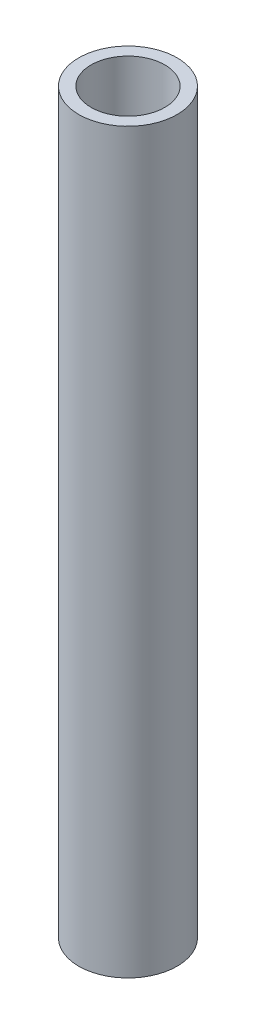
ISO-10303-21;
HEADER;
FILE_DESCRIPTION(('STEP AP214'),'2;1');
FILE_NAME('part.step','',(''),(''),'','','');
FILE_SCHEMA(('AUTOMOTIVE_DESIGN { 1 0 10303 214 1 1 1 1 }'));
ENDSEC;
DATA;
#1=APPLICATION_CONTEXT('core data for automotive mechanical design processes');
#2=APPLICATION_PROTOCOL_DEFINITION('international standard','automotive_design',2000,#1);
#3=PRODUCT_CONTEXT('',#1,'mechanical');
#4=PRODUCT('Part','Part','',(#3));
#5=PRODUCT_RELATED_PRODUCT_CATEGORY('part','',(#4));
#6=PRODUCT_DEFINITION_FORMATION('','',#4);
#7=PRODUCT_DEFINITION_CONTEXT('part definition',#1,'design');
#8=PRODUCT_DEFINITION('design','',#6,#7);
#9=PRODUCT_DEFINITION_SHAPE('','',#8);
#10=(LENGTH_UNIT() NAMED_UNIT(*) SI_UNIT(.MILLI.,.METRE.));
#11=(NAMED_UNIT(*) PLANE_ANGLE_UNIT() SI_UNIT($,.RADIAN.));
#12=(NAMED_UNIT(*) SI_UNIT($,.STERADIAN.) SOLID_ANGLE_UNIT());
#13=UNCERTAINTY_MEASURE_WITH_UNIT(LENGTH_MEASURE(1.E-05),#10,'distance_accuracy_value','');
#14=(GEOMETRIC_REPRESENTATION_CONTEXT(3) GLOBAL_UNCERTAINTY_ASSIGNED_CONTEXT((#13)) GLOBAL_UNIT_ASSIGNED_CONTEXT((#10,
#11,#12)) REPRESENTATION_CONTEXT('',''));
#15=CARTESIAN_POINT('',(0.,0.,0.));
#16=DIRECTION('',(0.,0.,1.));
#17=DIRECTION('',(1.,0.,0.));
#18=AXIS2_PLACEMENT_3D('',#15,#16,#17);
#19=CARTESIAN_POINT('',(0.,60.,0.));
#20=DIRECTION('',(0.,1.,0.));
#21=DIRECTION('',(0.,0.,1.));
#22=AXIS2_PLACEMENT_3D('',#19,#20,#21);
#23=PLANE('',#22);
#24=CARTESIAN_POINT('',(0.,60.,0.));
#25=DIRECTION('',(0.,1.,0.));
#26=DIRECTION('',(0.,0.,1.));
#27=AXIS2_PLACEMENT_3D('',#24,#25,#26);
#28=CIRCLE('',#27,4.);
#29=CARTESIAN_POINT('',(0.,60.,4.));
#30=VERTEX_POINT('',#29);
#31=EDGE_CURVE('E10',#30,#30,#28,.T.);
#32=ORIENTED_EDGE('',*,*,#31,.T.);
#33=EDGE_LOOP('',(#32));
#34=FACE_BOUND('',#33,.T.);
#35=CARTESIAN_POINT('',(0.,60.,0.));
#36=DIRECTION('',(0.,1.,0.));
#37=DIRECTION('',(0.,0.,1.));
#38=AXIS2_PLACEMENT_3D('',#35,#36,#37);
#39=CIRCLE('',#38,3.);
#40=CARTESIAN_POINT('',(0.,60.,3.));
#41=VERTEX_POINT('',#40);
#42=EDGE_CURVE('E44',#41,#41,#39,.T.);
#43=ORIENTED_EDGE('',*,*,#42,.F.);
#44=EDGE_LOOP('',(#43));
#45=FACE_BOUND('',#44,.T.);
#46=ADVANCED_FACE('F33',(#34,#45),#23,.T.);
#47=CARTESIAN_POINT('',(0.,0.,0.));
#48=DIRECTION('',(0.,1.,0.));
#49=DIRECTION('',(0.,0.,1.));
#50=AXIS2_PLACEMENT_3D('',#47,#48,#49);
#51=PLANE('',#50);
#52=CARTESIAN_POINT('',(0.,0.,0.));
#53=DIRECTION('',(0.,1.,0.));
#54=DIRECTION('',(0.,0.,1.));
#55=AXIS2_PLACEMENT_3D('',#52,#53,#54);
#56=CIRCLE('',#55,4.);
#57=CARTESIAN_POINT('',(0.,0.,4.));
#58=VERTEX_POINT('',#57);
#59=EDGE_CURVE('E37',#58,#58,#56,.T.);
#60=ORIENTED_EDGE('',*,*,#59,.F.);
#61=EDGE_LOOP('',(#60));
#62=FACE_BOUND('',#61,.T.);
#63=CARTESIAN_POINT('',(0.,0.,0.));
#64=DIRECTION('',(0.,1.,0.));
#65=DIRECTION('',(0.,0.,1.));
#66=AXIS2_PLACEMENT_3D('',#63,#64,#65);
#67=CIRCLE('',#66,3.);
#68=CARTESIAN_POINT('',(0.,0.,3.));
#69=VERTEX_POINT('',#68);
#70=EDGE_CURVE('E46',#69,#69,#67,.T.);
#71=ORIENTED_EDGE('',*,*,#70,.T.);
#72=EDGE_LOOP('',(#71));
#73=FACE_BOUND('',#72,.T.);
#74=ADVANCED_FACE('F56',(#62,#73),#51,.F.);
#75=CARTESIAN_POINT('',(0.,60.,0.));
#76=DIRECTION('',(0.,-1.,0.));
#77=DIRECTION('',(0.,0.,-1.));
#78=AXIS2_PLACEMENT_3D('',#75,#76,#77);
#79=CYLINDRICAL_SURFACE('',#78,4.);
#80=ORIENTED_EDGE('',*,*,#31,.F.);
#81=EDGE_LOOP('',(#80));
#82=FACE_BOUND('',#81,.T.);
#83=ORIENTED_EDGE('',*,*,#59,.T.);
#84=EDGE_LOOP('',(#83));
#85=FACE_BOUND('',#84,.T.);
#86=ADVANCED_FACE('F35',(#82,#85),#79,.T.);
#87=CARTESIAN_POINT('',(0.,60.,0.));
#88=DIRECTION('',(0.,-1.,0.));
#89=DIRECTION('',(0.,0.,-1.));
#90=AXIS2_PLACEMENT_3D('',#87,#88,#89);
#91=CYLINDRICAL_SURFACE('',#90,3.);
#92=ORIENTED_EDGE('',*,*,#42,.T.);
#93=EDGE_LOOP('',(#92));
#94=FACE_BOUND('',#93,.T.);
#95=ORIENTED_EDGE('',*,*,#70,.F.);
#96=EDGE_LOOP('',(#95));
#97=FACE_BOUND('',#96,.T.);
#98=ADVANCED_FACE('F52',(#94,#97),#91,.F.);
#99=CLOSED_SHELL('',(#46,#74,#86,#98));
#100=MANIFOLD_SOLID_BREP('B2',#99);
#101=ADVANCED_BREP_SHAPE_REPRESENTATION('',(#18,#100),#14);
#102=SHAPE_DEFINITION_REPRESENTATION(#9,#101);
ENDSEC;
END-ISO-10303-21;
